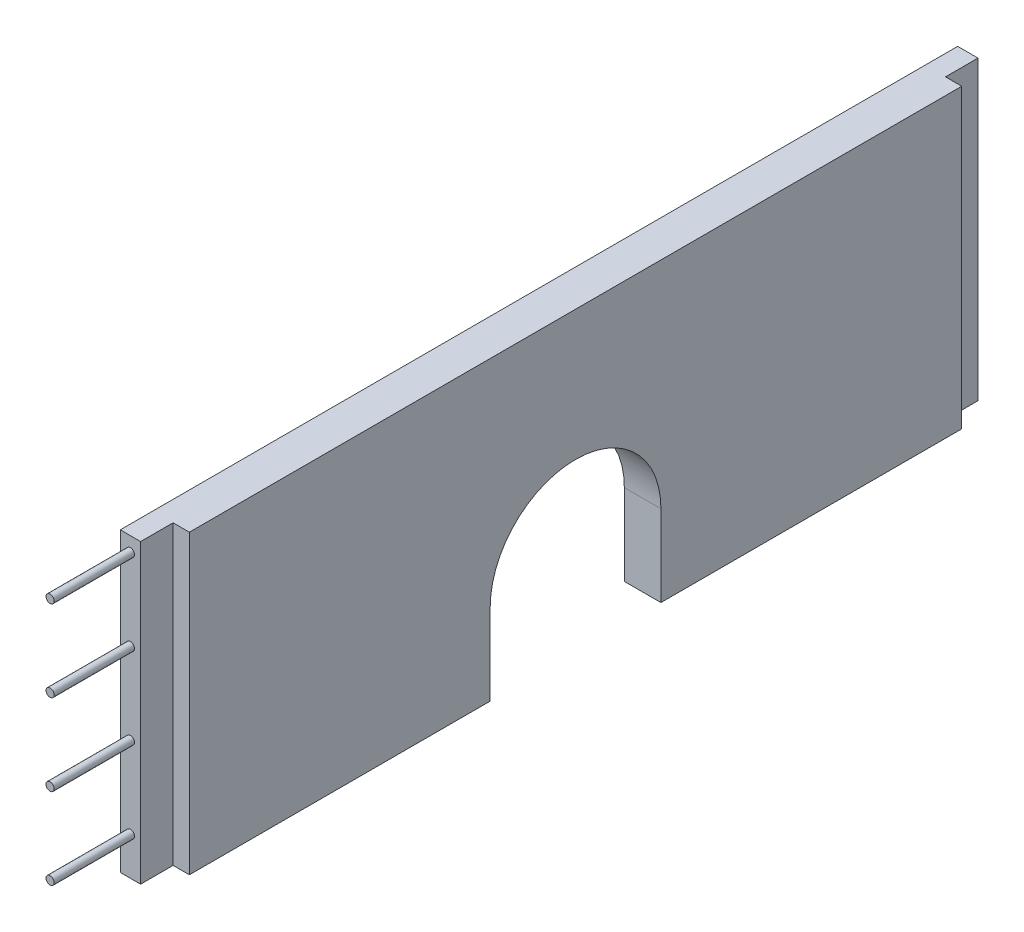
ISO-10303-21;
HEADER;
FILE_DESCRIPTION(('STEP AP214'),'2;1');
FILE_NAME('part.step','',(''),(''),'','','');
FILE_SCHEMA(('AUTOMOTIVE_DESIGN { 1 0 10303 214 1 1 1 1 }'));
ENDSEC;
DATA;
#1=APPLICATION_CONTEXT('core data for automotive mechanical design processes');
#2=APPLICATION_PROTOCOL_DEFINITION('international standard','automotive_design',2000,#1);
#3=PRODUCT_CONTEXT('',#1,'mechanical');
#4=PRODUCT('Part','Part','',(#3));
#5=PRODUCT_RELATED_PRODUCT_CATEGORY('part','',(#4));
#6=PRODUCT_DEFINITION_FORMATION('','',#4);
#7=PRODUCT_DEFINITION_CONTEXT('part definition',#1,'design');
#8=PRODUCT_DEFINITION('design','',#6,#7);
#9=PRODUCT_DEFINITION_SHAPE('','',#8);
#10=(LENGTH_UNIT() NAMED_UNIT(*) SI_UNIT(.MILLI.,.METRE.));
#11=(NAMED_UNIT(*) PLANE_ANGLE_UNIT() SI_UNIT($,.RADIAN.));
#12=(NAMED_UNIT(*) SI_UNIT($,.STERADIAN.) SOLID_ANGLE_UNIT());
#13=UNCERTAINTY_MEASURE_WITH_UNIT(LENGTH_MEASURE(1.E-05),#10,'distance_accuracy_value','');
#14=(GEOMETRIC_REPRESENTATION_CONTEXT(3) GLOBAL_UNCERTAINTY_ASSIGNED_CONTEXT((#13)) GLOBAL_UNIT_ASSIGNED_CONTEXT((#10,
#11,#12)) REPRESENTATION_CONTEXT('',''));
#15=CARTESIAN_POINT('',(0.,0.,0.));
#16=DIRECTION('',(0.,0.,1.));
#17=DIRECTION('',(1.,0.,0.));
#18=AXIS2_PLACEMENT_3D('',#15,#16,#17);
#19=CARTESIAN_POINT('',(2.5,99.5,0.));
#20=DIRECTION('',(1.,0.,0.));
#21=DIRECTION('',(0.,0.,-1.));
#22=AXIS2_PLACEMENT_3D('',#19,#20,#21);
#23=PLANE('',#22);
#24=DIRECTION('',(0.,-1.,0.));
#25=VECTOR('',#24,1.);
#26=CARTESIAN_POINT('',(2.5,99.5,0.));
#27=LINE('',#26,#25);
#28=CARTESIAN_POINT('',(2.5,36.5,0.));
#29=VERTEX_POINT('',#28);
#30=CARTESIAN_POINT('',(2.5,0.,0.));
#31=VERTEX_POINT('',#30);
#32=EDGE_CURVE('E267',#29,#31,#27,.T.);
#33=ORIENTED_EDGE('',*,*,#32,.F.);
#34=DIRECTION('',(0.,0.,-1.));
#35=VECTOR('',#34,1.);
#36=CARTESIAN_POINT('',(2.5,36.5,4.));
#37=LINE('',#36,#35);
#38=CARTESIAN_POINT('',(2.5,36.5,4.));
#39=VERTEX_POINT('',#38);
#40=EDGE_CURVE('E193',#39,#29,#37,.T.);
#41=ORIENTED_EDGE('',*,*,#40,.F.);
#42=DIRECTION('',(0.,-1.,0.));
#43=VECTOR('',#42,1.);
#44=CARTESIAN_POINT('',(2.5,99.5,4.));
#45=LINE('',#44,#43);
#46=CARTESIAN_POINT('',(2.5,0.,4.));
#47=VERTEX_POINT('',#46);
#48=EDGE_CURVE('E252',#39,#47,#45,.T.);
#49=ORIENTED_EDGE('',*,*,#48,.T.);
#50=DIRECTION('',(0.,0.,1.));
#51=VECTOR('',#50,1.);
#52=CARTESIAN_POINT('',(2.5,0.,0.));
#53=LINE('',#52,#51);
#54=EDGE_CURVE('E228',#31,#47,#53,.T.);
#55=ORIENTED_EDGE('',*,*,#54,.F.);
#56=EDGE_LOOP('',(#33,#41,#49,#55));
#57=FACE_BOUND('',#56,.T.);
#58=ADVANCED_FACE('F47',(#57),#23,.T.);
#59=CARTESIAN_POINT('',(0.,99.5,0.));
#60=DIRECTION('',(0.,0.,-1.));
#61=DIRECTION('',(-1.,0.,0.));
#62=AXIS2_PLACEMENT_3D('',#59,#60,#61);
#63=PLANE('',#62);
#64=DIRECTION('',(0.,-1.,0.));
#65=VECTOR('',#64,1.);
#66=CARTESIAN_POINT('',(0.,99.5,0.));
#67=LINE('',#66,#65);
#68=CARTESIAN_POINT('',(0.,36.5,0.));
#69=VERTEX_POINT('',#68);
#70=CARTESIAN_POINT('',(0.,0.,0.));
#71=VERTEX_POINT('',#70);
#72=EDGE_CURVE('E265',#69,#71,#67,.T.);
#73=ORIENTED_EDGE('',*,*,#72,.F.);
#74=DIRECTION('',(-1.,0.,0.));
#75=VECTOR('',#74,1.);
#76=CARTESIAN_POINT('',(2.5,36.5,0.));
#77=LINE('',#76,#75);
#78=EDGE_CURVE('E195',#29,#69,#77,.T.);
#79=ORIENTED_EDGE('',*,*,#78,.F.);
#80=ORIENTED_EDGE('',*,*,#32,.T.);
#81=DIRECTION('',(1.,0.,0.));
#82=VECTOR('',#81,1.);
#83=CARTESIAN_POINT('',(0.,0.,0.));
#84=LINE('',#83,#82);
#85=EDGE_CURVE('E231',#71,#31,#84,.T.);
#86=ORIENTED_EDGE('',*,*,#85,.F.);
#87=EDGE_LOOP('',(#73,#79,#80,#86));
#88=FACE_BOUND('',#87,.T.);
#89=ADVANCED_FACE('F49',(#88),#63,.T.);
#90=CARTESIAN_POINT('',(0.,99.5,0.));
#91=DIRECTION('',(1.,0.,0.));
#92=DIRECTION('',(0.,0.,-1.));
#93=AXIS2_PLACEMENT_3D('',#90,#91,#92);
#94=PLANE('',#93);
#95=DIRECTION('',(0.,0.,-1.));
#96=VECTOR('',#95,1.);
#97=CARTESIAN_POINT('',(0.,10.,82.5));
#98=LINE('',#97,#96);
#99=CARTESIAN_POINT('',(0.,10.,82.5));
#100=VERTEX_POINT('',#99);
#101=CARTESIAN_POINT('',(0.,10.,65.4999999999993));
#102=VERTEX_POINT('',#101);
#103=EDGE_CURVE('E167',#100,#102,#98,.T.);
#104=ORIENTED_EDGE('',*,*,#103,.F.);
#105=DIRECTION('',(0.,-1.,0.));
#106=VECTOR('',#105,1.);
#107=CARTESIAN_POINT('',(0.,10.,82.5));
#108=LINE('',#107,#106);
#109=CARTESIAN_POINT('',(0.,0.,82.5));
#110=VERTEX_POINT('',#109);
#111=EDGE_CURVE('E191',#100,#110,#108,.T.);
#112=ORIENTED_EDGE('',*,*,#111,.T.);
#113=DIRECTION('',(0.,0.,1.));
#114=VECTOR('',#113,1.);
#115=CARTESIAN_POINT('',(0.,0.,0.));
#116=LINE('',#115,#114);
#117=CARTESIAN_POINT('',(0.,0.,103.));
#118=VERTEX_POINT('',#117);
#119=EDGE_CURVE('E235',#110,#118,#116,.T.);
#120=ORIENTED_EDGE('',*,*,#119,.T.);
#121=DIRECTION('',(0.,-1.,0.));
#122=VECTOR('',#121,1.);
#123=CARTESIAN_POINT('',(0.,99.5,103.));
#124=LINE('',#123,#122);
#125=CARTESIAN_POINT('',(0.,36.5,103.));
#126=VERTEX_POINT('',#125);
#127=EDGE_CURVE('E262',#126,#118,#124,.T.);
#128=ORIENTED_EDGE('',*,*,#127,.F.);
#129=DIRECTION('',(0.,0.,1.));
#130=VECTOR('',#129,1.);
#131=CARTESIAN_POINT('',(0.,36.5,0.));
#132=LINE('',#131,#130);
#133=EDGE_CURVE('E197',#69,#126,#132,.T.);
#134=ORIENTED_EDGE('',*,*,#133,.F.);
#135=ORIENTED_EDGE('',*,*,#72,.T.);
#136=CARTESIAN_POINT('',(0.,0.,41.));
#137=VERTEX_POINT('',#136);
#138=EDGE_CURVE('E236',#71,#137,#116,.T.);
#139=ORIENTED_EDGE('',*,*,#138,.T.);
#140=DIRECTION('',(0.,-1.,0.));
#141=VECTOR('',#140,1.);
#142=CARTESIAN_POINT('',(0.,9.99999999999999,41.));
#143=LINE('',#142,#141);
#144=CARTESIAN_POINT('',(0.,9.99999999999999,41.));
#145=VERTEX_POINT('',#144);
#146=EDGE_CURVE('E206',#145,#137,#143,.T.);
#147=ORIENTED_EDGE('',*,*,#146,.F.);
#148=CARTESIAN_POINT('',(0.,9.99999999999999,51.5));
#149=DIRECTION('',(1.,0.,0.));
#150=DIRECTION('',(0.,0.,-1.));
#151=AXIS2_PLACEMENT_3D('',#148,#149,#150);
#152=CIRCLE('',#151,10.5);
#153=CARTESIAN_POINT('',(0.,9.99999999999999,62.));
#154=VERTEX_POINT('',#153);
#155=EDGE_CURVE('E208',#154,#145,#152,.F.);
#156=ORIENTED_EDGE('',*,*,#155,.F.);
#157=DIRECTION('',(0.,1.,0.));
#158=VECTOR('',#157,1.);
#159=CARTESIAN_POINT('',(0.,9.99999999999999,62.));
#160=LINE('',#159,#158);
#161=CARTESIAN_POINT('',(0.,0.,62.));
#162=VERTEX_POINT('',#161);
#163=EDGE_CURVE('E211',#162,#154,#160,.T.);
#164=ORIENTED_EDGE('',*,*,#163,.F.);
#165=CARTESIAN_POINT('',(0.,0.,65.4999999999993));
#166=VERTEX_POINT('',#165);
#167=EDGE_CURVE('E182',#162,#166,#116,.T.);
#168=ORIENTED_EDGE('',*,*,#167,.T.);
#169=DIRECTION('',(0.,-1.,0.));
#170=VECTOR('',#169,1.);
#171=CARTESIAN_POINT('',(0.,10.,65.4999999999993));
#172=LINE('',#171,#170);
#173=EDGE_CURVE('E62',#102,#166,#172,.T.);
#174=ORIENTED_EDGE('',*,*,#173,.F.);
#175=EDGE_LOOP('',(#104,#112,#120,#128,#134,#135,#139,#147,#156,#164,#168,#174));
#176=FACE_BOUND('',#175,.T.);
#177=ADVANCED_FACE('F179',(#176),#94,.F.);
#178=CARTESIAN_POINT('',(0.,99.5,103.));
#179=DIRECTION('',(0.,0.,-1.));
#180=DIRECTION('',(-1.,0.,0.));
#181=AXIS2_PLACEMENT_3D('',#178,#179,#180);
#182=PLANE('',#181);
#183=CARTESIAN_POINT('',(1.25000000000032,4.72284857889942,103.));
#184=DIRECTION('',(0.,0.,-1.));
#185=DIRECTION('',(-1.,0.,0.));
#186=AXIS2_PLACEMENT_3D('',#183,#184,#185);
#187=CIRCLE('',#186,0.5);
#188=CARTESIAN_POINT('',(0.750000000000325,4.72284857889942,103.));
#189=VERTEX_POINT('',#188);
#190=EDGE_CURVE('E11',#189,#189,#187,.F.);
#191=ORIENTED_EDGE('',*,*,#190,.F.);
#192=EDGE_LOOP('',(#191));
#193=FACE_BOUND('',#192,.T.);
#194=CARTESIAN_POINT('',(1.25000000000022,14.7228485788994,103.));
#195=DIRECTION('',(0.,0.,-1.));
#196=DIRECTION('',(-1.,0.,0.));
#197=AXIS2_PLACEMENT_3D('',#194,#195,#196);
#198=CIRCLE('',#197,0.5);
#199=CARTESIAN_POINT('',(0.75000000000022,14.7228485788994,103.));
#200=VERTEX_POINT('',#199);
#201=EDGE_CURVE('E55',#200,#200,#198,.F.);
#202=ORIENTED_EDGE('',*,*,#201,.F.);
#203=EDGE_LOOP('',(#202));
#204=FACE_BOUND('',#203,.T.);
#205=CARTESIAN_POINT('',(1.25000000000012,24.7228485788994,103.));
#206=DIRECTION('',(0.,0.,-1.));
#207=DIRECTION('',(-1.,0.,0.));
#208=AXIS2_PLACEMENT_3D('',#205,#206,#207);
#209=CIRCLE('',#208,0.5);
#210=CARTESIAN_POINT('',(0.750000000000116,24.7228485788994,103.));
#211=VERTEX_POINT('',#210);
#212=EDGE_CURVE('E272',#211,#211,#209,.F.);
#213=ORIENTED_EDGE('',*,*,#212,.F.);
#214=EDGE_LOOP('',(#213));
#215=FACE_BOUND('',#214,.T.);
#216=CARTESIAN_POINT('',(1.25000000000001,34.7228485788994,103.));
#217=DIRECTION('',(0.,0.,-1.));
#218=DIRECTION('',(-1.,0.,0.));
#219=AXIS2_PLACEMENT_3D('',#216,#217,#218);
#220=CIRCLE('',#219,0.5);
#221=CARTESIAN_POINT('',(0.750000000000012,34.7228485788994,103.));
#222=VERTEX_POINT('',#221);
#223=EDGE_CURVE('E269',#222,#222,#220,.F.);
#224=ORIENTED_EDGE('',*,*,#223,.F.);
#225=EDGE_LOOP('',(#224));
#226=FACE_BOUND('',#225,.T.);
#227=DIRECTION('',(1.,0.,0.));
#228=VECTOR('',#227,1.);
#229=CARTESIAN_POINT('',(0.,36.5,103.));
#230=LINE('',#229,#228);
#231=CARTESIAN_POINT('',(2.50000000000001,36.5,103.));
#232=VERTEX_POINT('',#231);
#233=EDGE_CURVE('E199',#126,#232,#230,.T.);
#234=ORIENTED_EDGE('',*,*,#233,.F.);
#235=ORIENTED_EDGE('',*,*,#127,.T.);
#236=DIRECTION('',(1.,0.,0.));
#237=VECTOR('',#236,1.);
#238=CARTESIAN_POINT('',(0.,0.,103.));
#239=LINE('',#238,#237);
#240=CARTESIAN_POINT('',(2.50000000000001,0.,103.));
#241=VERTEX_POINT('',#240);
#242=EDGE_CURVE('E239',#118,#241,#239,.T.);
#243=ORIENTED_EDGE('',*,*,#242,.T.);
#244=DIRECTION('',(0.,-1.,0.));
#245=VECTOR('',#244,1.);
#246=CARTESIAN_POINT('',(2.50000000000001,99.5,103.));
#247=LINE('',#246,#245);
#248=EDGE_CURVE('E260',#232,#241,#247,.T.);
#249=ORIENTED_EDGE('',*,*,#248,.F.);
#250=EDGE_LOOP('',(#234,#235,#243,#249));
#251=FACE_BOUND('',#250,.T.);
#252=ADVANCED_FACE('F279',(#193,#204,#215,#226,#251),#182,.F.);
#253=DIRECTION('',(0.,-1.,0.));
#254=VECTOR('',#253,1.);
#255=CARTESIAN_POINT('',(2.50000000000001,99.5,99.));
#256=LINE('',#255,#254);
#257=CARTESIAN_POINT('',(2.50000000000001,36.5,99.));
#258=VERTEX_POINT('',#257);
#259=CARTESIAN_POINT('',(2.50000000000001,0.,99.));
#260=VERTEX_POINT('',#259);
#261=EDGE_CURVE('E258',#258,#260,#256,.T.);
#262=ORIENTED_EDGE('',*,*,#261,.F.);
#263=DIRECTION('',(0.,0.,-1.));
#264=VECTOR('',#263,1.);
#265=CARTESIAN_POINT('',(2.50000000000001,36.5,103.));
#266=LINE('',#265,#264);
#267=EDGE_CURVE('E201',#232,#258,#266,.T.);
#268=ORIENTED_EDGE('',*,*,#267,.F.);
#269=ORIENTED_EDGE('',*,*,#248,.T.);
#270=EDGE_CURVE('E232',#260,#241,#53,.T.);
#271=ORIENTED_EDGE('',*,*,#270,.F.);
#272=EDGE_LOOP('',(#262,#268,#269,#271));
#273=FACE_BOUND('',#272,.T.);
#274=ADVANCED_FACE('F282',(#273),#23,.T.);
#275=CARTESIAN_POINT('',(0.,99.5,99.));
#276=DIRECTION('',(0.,0.,-1.));
#277=DIRECTION('',(-1.,0.,0.));
#278=AXIS2_PLACEMENT_3D('',#275,#276,#277);
#279=PLANE('',#278);
#280=DIRECTION('',(1.,0.,0.));
#281=VECTOR('',#280,1.);
#282=CARTESIAN_POINT('',(2.50000000000001,36.5,99.));
#283=LINE('',#282,#281);
#284=CARTESIAN_POINT('',(4.50000000000001,36.5,99.));
#285=VERTEX_POINT('',#284);
#286=EDGE_CURVE('E203',#258,#285,#283,.T.);
#287=ORIENTED_EDGE('',*,*,#286,.F.);
#288=ORIENTED_EDGE('',*,*,#261,.T.);
#289=DIRECTION('',(1.,0.,0.));
#290=VECTOR('',#289,1.);
#291=CARTESIAN_POINT('',(0.,0.,99.));
#292=LINE('',#291,#290);
#293=CARTESIAN_POINT('',(4.50000000000001,0.,99.));
#294=VERTEX_POINT('',#293);
#295=EDGE_CURVE('E242',#260,#294,#292,.T.);
#296=ORIENTED_EDGE('',*,*,#295,.T.);
#297=DIRECTION('',(0.,-1.,0.));
#298=VECTOR('',#297,1.);
#299=CARTESIAN_POINT('',(4.50000000000001,99.5,99.));
#300=LINE('',#299,#298);
#301=EDGE_CURVE('E256',#285,#294,#300,.T.);
#302=ORIENTED_EDGE('',*,*,#301,.F.);
#303=EDGE_LOOP('',(#287,#288,#296,#302));
#304=FACE_BOUND('',#303,.T.);
#305=ADVANCED_FACE('F311',(#304),#279,.F.);
#306=CARTESIAN_POINT('',(4.5,99.5,0.));
#307=DIRECTION('',(1.,0.,0.));
#308=DIRECTION('',(0.,0.,-1.));
#309=AXIS2_PLACEMENT_3D('',#306,#307,#308);
#310=PLANE('',#309);
#311=DIRECTION('',(0.,-1.,0.));
#312=VECTOR('',#311,1.);
#313=CARTESIAN_POINT('',(4.5,99.5,4.));
#314=LINE('',#313,#312);
#315=CARTESIAN_POINT('',(4.5,36.5,4.));
#316=VERTEX_POINT('',#315);
#317=CARTESIAN_POINT('',(4.5,0.,4.));
#318=VERTEX_POINT('',#317);
#319=EDGE_CURVE('E254',#316,#318,#314,.T.);
#320=ORIENTED_EDGE('',*,*,#319,.F.);
#321=DIRECTION('',(0.,0.,-1.));
#322=VECTOR('',#321,1.);
#323=CARTESIAN_POINT('',(4.50000000000001,36.5,99.));
#324=LINE('',#323,#322);
#325=EDGE_CURVE('E70',#285,#316,#324,.T.);
#326=ORIENTED_EDGE('',*,*,#325,.F.);
#327=ORIENTED_EDGE('',*,*,#301,.T.);
#328=DIRECTION('',(0.,0.,1.));
#329=VECTOR('',#328,1.);
#330=CARTESIAN_POINT('',(4.5,0.,0.));
#331=LINE('',#330,#329);
#332=CARTESIAN_POINT('',(4.50000000000001,0.,62.));
#333=VERTEX_POINT('',#332);
#334=EDGE_CURVE('E245',#333,#294,#331,.T.);
#335=ORIENTED_EDGE('',*,*,#334,.F.);
#336=DIRECTION('',(0.,-1.,0.));
#337=VECTOR('',#336,1.);
#338=CARTESIAN_POINT('',(4.50000000000001,9.99999999999999,62.));
#339=LINE('',#338,#337);
#340=CARTESIAN_POINT('',(4.50000000000001,9.99999999999999,62.));
#341=VERTEX_POINT('',#340);
#342=EDGE_CURVE('E214',#341,#333,#339,.T.);
#343=ORIENTED_EDGE('',*,*,#342,.F.);
#344=CARTESIAN_POINT('',(4.50000000000001,9.99999999999999,51.5));
#345=DIRECTION('',(1.,0.,0.));
#346=DIRECTION('',(0.,0.,-1.));
#347=AXIS2_PLACEMENT_3D('',#344,#345,#346);
#348=CIRCLE('',#347,10.5);
#349=CARTESIAN_POINT('',(4.5,9.99999999999999,41.));
#350=VERTEX_POINT('',#349);
#351=EDGE_CURVE('E205',#350,#341,#348,.T.);
#352=ORIENTED_EDGE('',*,*,#351,.F.);
#353=DIRECTION('',(0.,1.,0.));
#354=VECTOR('',#353,1.);
#355=CARTESIAN_POINT('',(4.5,9.99999999999999,41.));
#356=LINE('',#355,#354);
#357=CARTESIAN_POINT('',(4.5,0.,41.));
#358=VERTEX_POINT('',#357);
#359=EDGE_CURVE('E216',#358,#350,#356,.T.);
#360=ORIENTED_EDGE('',*,*,#359,.F.);
#361=EDGE_CURVE('E246',#318,#358,#331,.T.);
#362=ORIENTED_EDGE('',*,*,#361,.F.);
#363=EDGE_LOOP('',(#320,#326,#327,#335,#343,#352,#360,#362));
#364=FACE_BOUND('',#363,.T.);
#365=ADVANCED_FACE('F315',(#364),#310,.T.);
#366=CARTESIAN_POINT('',(0.,99.5,4.));
#367=DIRECTION('',(0.,0.,-1.));
#368=DIRECTION('',(-1.,0.,0.));
#369=AXIS2_PLACEMENT_3D('',#366,#367,#368);
#370=PLANE('',#369);
#371=ORIENTED_EDGE('',*,*,#48,.F.);
#372=DIRECTION('',(-1.,0.,0.));
#373=VECTOR('',#372,1.);
#374=CARTESIAN_POINT('',(4.5,36.5,4.));
#375=LINE('',#374,#373);
#376=EDGE_CURVE('E190',#316,#39,#375,.T.);
#377=ORIENTED_EDGE('',*,*,#376,.F.);
#378=ORIENTED_EDGE('',*,*,#319,.T.);
#379=DIRECTION('',(1.,0.,0.));
#380=VECTOR('',#379,1.);
#381=CARTESIAN_POINT('',(0.,0.,4.));
#382=LINE('',#381,#380);
#383=EDGE_CURVE('E249',#47,#318,#382,.T.);
#384=ORIENTED_EDGE('',*,*,#383,.F.);
#385=EDGE_LOOP('',(#371,#377,#378,#384));
#386=FACE_BOUND('',#385,.T.);
#387=ADVANCED_FACE('F338',(#386),#370,.T.);
#388=CARTESIAN_POINT('',(0.,0.,0.));
#389=DIRECTION('',(0.,1.,0.));
#390=DIRECTION('',(0.,0.,1.));
#391=AXIS2_PLACEMENT_3D('',#388,#389,#390);
#392=PLANE('',#391);
#393=ORIENTED_EDGE('',*,*,#361,.T.);
#394=DIRECTION('',(1.,0.,0.));
#395=VECTOR('',#394,1.);
#396=CARTESIAN_POINT('',(-29.3470611816584,0.,41.));
#397=LINE('',#396,#395);
#398=EDGE_CURVE('E221',#137,#358,#397,.T.);
#399=ORIENTED_EDGE('',*,*,#398,.F.);
#400=ORIENTED_EDGE('',*,*,#138,.F.);
#401=ORIENTED_EDGE('',*,*,#85,.T.);
#402=ORIENTED_EDGE('',*,*,#54,.T.);
#403=ORIENTED_EDGE('',*,*,#383,.T.);
#404=EDGE_LOOP('',(#393,#399,#400,#401,#402,#403));
#405=FACE_BOUND('',#404,.T.);
#406=ADVANCED_FACE('F332',(#405),#392,.F.);
#407=ORIENTED_EDGE('',*,*,#119,.F.);
#408=DIRECTION('',(-1.,0.,0.));
#409=VECTOR('',#408,1.);
#410=CARTESIAN_POINT('',(0.,0.,82.5));
#411=LINE('',#410,#409);
#412=CARTESIAN_POINT('',(1.6000000000003,0.,82.5));
#413=VERTEX_POINT('',#412);
#414=EDGE_CURVE('E176',#413,#110,#411,.T.);
#415=ORIENTED_EDGE('',*,*,#414,.F.);
#416=DIRECTION('',(0.,0.,1.));
#417=VECTOR('',#416,1.);
#418=CARTESIAN_POINT('',(1.6000000000003,0.,82.5));
#419=LINE('',#418,#417);
#420=CARTESIAN_POINT('',(1.6000000000003,0.,65.4999999999993));
#421=VERTEX_POINT('',#420);
#422=EDGE_CURVE('E437',#421,#413,#419,.T.);
#423=ORIENTED_EDGE('',*,*,#422,.F.);
#424=DIRECTION('',(1.,0.,0.));
#425=VECTOR('',#424,1.);
#426=CARTESIAN_POINT('',(0.,0.,65.4999999999993));
#427=LINE('',#426,#425);
#428=EDGE_CURVE('E433',#166,#421,#427,.T.);
#429=ORIENTED_EDGE('',*,*,#428,.F.);
#430=ORIENTED_EDGE('',*,*,#167,.F.);
#431=DIRECTION('',(1.,0.,0.));
#432=VECTOR('',#431,1.);
#433=CARTESIAN_POINT('',(-29.3470611816584,0.,62.));
#434=LINE('',#433,#432);
#435=EDGE_CURVE('E223',#162,#333,#434,.T.);
#436=ORIENTED_EDGE('',*,*,#435,.T.);
#437=ORIENTED_EDGE('',*,*,#334,.T.);
#438=ORIENTED_EDGE('',*,*,#295,.F.);
#439=ORIENTED_EDGE('',*,*,#270,.T.);
#440=ORIENTED_EDGE('',*,*,#242,.F.);
#441=EDGE_LOOP('',(#407,#415,#423,#429,#430,#436,#437,#438,#439,#440));
#442=FACE_BOUND('',#441,.T.);
#443=ADVANCED_FACE('F299',(#442),#392,.F.);
#444=CARTESIAN_POINT('',(-29.3470611816584,9.99999999999999,51.5));
#445=DIRECTION('',(1.,0.,0.));
#446=DIRECTION('',(0.,0.,-1.));
#447=AXIS2_PLACEMENT_3D('',#444,#445,#446);
#448=CYLINDRICAL_SURFACE('',#447,10.5);
#449=ORIENTED_EDGE('',*,*,#155,.T.);
#450=DIRECTION('',(1.,0.,0.));
#451=VECTOR('',#450,1.);
#452=CARTESIAN_POINT('',(-29.3470611816584,9.99999999999999,41.));
#453=LINE('',#452,#451);
#454=EDGE_CURVE('E209',#145,#350,#453,.T.);
#455=ORIENTED_EDGE('',*,*,#454,.T.);
#456=ORIENTED_EDGE('',*,*,#351,.T.);
#457=DIRECTION('',(1.,0.,0.));
#458=VECTOR('',#457,1.);
#459=CARTESIAN_POINT('',(-29.3470611816584,9.99999999999999,62.));
#460=LINE('',#459,#458);
#461=EDGE_CURVE('E219',#154,#341,#460,.T.);
#462=ORIENTED_EDGE('',*,*,#461,.F.);
#463=EDGE_LOOP('',(#449,#455,#456,#462));
#464=FACE_BOUND('',#463,.T.);
#465=ADVANCED_FACE('F324',(#464),#448,.F.);
#466=CARTESIAN_POINT('',(-29.3470611816584,9.99999999999999,41.));
#467=DIRECTION('',(0.,0.,-1.));
#468=DIRECTION('',(-1.,0.,0.));
#469=AXIS2_PLACEMENT_3D('',#466,#467,#468);
#470=PLANE('',#469);
#471=ORIENTED_EDGE('',*,*,#146,.T.);
#472=ORIENTED_EDGE('',*,*,#398,.T.);
#473=ORIENTED_EDGE('',*,*,#359,.T.);
#474=ORIENTED_EDGE('',*,*,#454,.F.);
#475=EDGE_LOOP('',(#471,#472,#473,#474));
#476=FACE_BOUND('',#475,.T.);
#477=ADVANCED_FACE('F326',(#476),#470,.F.);
#478=CARTESIAN_POINT('',(-29.3470611816584,9.99999999999999,62.));
#479=DIRECTION('',(0.,0.,1.));
#480=DIRECTION('',(1.,0.,0.));
#481=AXIS2_PLACEMENT_3D('',#478,#479,#480);
#482=PLANE('',#481);
#483=ORIENTED_EDGE('',*,*,#163,.T.);
#484=ORIENTED_EDGE('',*,*,#461,.T.);
#485=ORIENTED_EDGE('',*,*,#342,.T.);
#486=ORIENTED_EDGE('',*,*,#435,.F.);
#487=EDGE_LOOP('',(#483,#484,#485,#486));
#488=FACE_BOUND('',#487,.T.);
#489=ADVANCED_FACE('F318',(#488),#482,.F.);
#490=CARTESIAN_POINT('',(0.,36.5,0.));
#491=DIRECTION('',(0.,1.,0.));
#492=DIRECTION('',(0.,0.,1.));
#493=AXIS2_PLACEMENT_3D('',#490,#491,#492);
#494=PLANE('',#493);
#495=ORIENTED_EDGE('',*,*,#325,.T.);
#496=ORIENTED_EDGE('',*,*,#376,.T.);
#497=ORIENTED_EDGE('',*,*,#40,.T.);
#498=ORIENTED_EDGE('',*,*,#78,.T.);
#499=ORIENTED_EDGE('',*,*,#133,.T.);
#500=ORIENTED_EDGE('',*,*,#233,.T.);
#501=ORIENTED_EDGE('',*,*,#267,.T.);
#502=ORIENTED_EDGE('',*,*,#286,.T.);
#503=EDGE_LOOP('',(#495,#496,#497,#498,#499,#500,#501,#502));
#504=FACE_BOUND('',#503,.T.);
#505=ADVANCED_FACE('F308',(#504),#494,.T.);
#506=CARTESIAN_POINT('',(0.,10.,82.5));
#507=DIRECTION('',(0.,0.,1.));
#508=DIRECTION('',(1.,0.,0.));
#509=AXIS2_PLACEMENT_3D('',#506,#507,#508);
#510=PLANE('',#509);
#511=ORIENTED_EDGE('',*,*,#414,.T.);
#512=ORIENTED_EDGE('',*,*,#111,.F.);
#513=DIRECTION('',(-1.,0.,0.));
#514=VECTOR('',#513,1.);
#515=CARTESIAN_POINT('',(0.,10.,82.5));
#516=LINE('',#515,#514);
#517=CARTESIAN_POINT('',(1.6000000000003,10.,82.5));
#518=VERTEX_POINT('',#517);
#519=EDGE_CURVE('E173',#518,#100,#516,.T.);
#520=ORIENTED_EDGE('',*,*,#519,.F.);
#521=DIRECTION('',(0.,-1.,0.));
#522=VECTOR('',#521,1.);
#523=CARTESIAN_POINT('',(1.6000000000003,10.,82.5));
#524=LINE('',#523,#522);
#525=EDGE_CURVE('E184',#518,#413,#524,.T.);
#526=ORIENTED_EDGE('',*,*,#525,.T.);
#527=EDGE_LOOP('',(#511,#512,#520,#526));
#528=FACE_BOUND('',#527,.T.);
#529=ADVANCED_FACE('F376',(#528),#510,.F.);
#530=CARTESIAN_POINT('',(1.6000000000003,10.,82.5));
#531=DIRECTION('',(1.,0.,0.));
#532=DIRECTION('',(0.,0.,-1.));
#533=AXIS2_PLACEMENT_3D('',#530,#531,#532);
#534=PLANE('',#533);
#535=ORIENTED_EDGE('',*,*,#422,.T.);
#536=ORIENTED_EDGE('',*,*,#525,.F.);
#537=DIRECTION('',(0.,0.,1.));
#538=VECTOR('',#537,1.);
#539=CARTESIAN_POINT('',(1.6000000000003,10.,82.5));
#540=LINE('',#539,#538);
#541=CARTESIAN_POINT('',(1.6000000000003,10.,65.4999999999993));
#542=VERTEX_POINT('',#541);
#543=EDGE_CURVE('E166',#542,#518,#540,.T.);
#544=ORIENTED_EDGE('',*,*,#543,.F.);
#545=DIRECTION('',(0.,-1.,0.));
#546=VECTOR('',#545,1.);
#547=CARTESIAN_POINT('',(1.6000000000003,10.,65.4999999999993));
#548=LINE('',#547,#546);
#549=EDGE_CURVE('E162',#542,#421,#548,.T.);
#550=ORIENTED_EDGE('',*,*,#549,.T.);
#551=EDGE_LOOP('',(#535,#536,#544,#550));
#552=FACE_BOUND('',#551,.T.);
#553=ADVANCED_FACE('F379',(#552),#534,.F.);
#554=CARTESIAN_POINT('',(0.,10.,65.4999999999993));
#555=DIRECTION('',(0.,0.,-1.));
#556=DIRECTION('',(-1.,0.,0.));
#557=AXIS2_PLACEMENT_3D('',#554,#555,#556);
#558=PLANE('',#557);
#559=ORIENTED_EDGE('',*,*,#428,.T.);
#560=ORIENTED_EDGE('',*,*,#549,.F.);
#561=DIRECTION('',(1.,0.,0.));
#562=VECTOR('',#561,1.);
#563=CARTESIAN_POINT('',(0.,10.,65.4999999999993));
#564=LINE('',#563,#562);
#565=EDGE_CURVE('E159',#102,#542,#564,.T.);
#566=ORIENTED_EDGE('',*,*,#565,.F.);
#567=ORIENTED_EDGE('',*,*,#173,.T.);
#568=EDGE_LOOP('',(#559,#560,#566,#567));
#569=FACE_BOUND('',#568,.T.);
#570=ADVANCED_FACE('F161',(#569),#558,.F.);
#571=CARTESIAN_POINT('',(0.,10.,0.));
#572=DIRECTION('',(0.,-1.,0.));
#573=DIRECTION('',(0.,0.,-1.));
#574=AXIS2_PLACEMENT_3D('',#571,#572,#573);
#575=PLANE('',#574);
#576=ORIENTED_EDGE('',*,*,#103,.T.);
#577=ORIENTED_EDGE('',*,*,#565,.T.);
#578=ORIENTED_EDGE('',*,*,#543,.T.);
#579=ORIENTED_EDGE('',*,*,#519,.T.);
#580=EDGE_LOOP('',(#576,#577,#578,#579));
#581=FACE_BOUND('',#580,.T.);
#582=ADVANCED_FACE('F171',(#581),#575,.T.);
#583=CARTESIAN_POINT('',(1.25000000000001,34.7228485788994,114.300677153207));
#584=DIRECTION('',(0.,0.,-1.));
#585=DIRECTION('',(-1.,0.,0.));
#586=AXIS2_PLACEMENT_3D('',#583,#584,#585);
#587=CYLINDRICAL_SURFACE('',#586,0.5);
#588=CARTESIAN_POINT('',(1.25000000000001,34.7228485788994,112.886463590834));
#589=DIRECTION('',(0.,0.,-1.));
#590=DIRECTION('',(0.,1.,0.));
#591=AXIS2_PLACEMENT_3D('',#588,#589,#590);
#592=CIRCLE('',#591,0.5);
#593=CARTESIAN_POINT('',(1.25000000000001,35.2228485788994,112.886463590834));
#594=VERTEX_POINT('',#593);
#595=EDGE_CURVE('E431',#594,#594,#592,.T.);
#596=ORIENTED_EDGE('',*,*,#595,.T.);
#597=EDGE_LOOP('',(#596));
#598=FACE_BOUND('',#597,.T.);
#599=ORIENTED_EDGE('',*,*,#223,.T.);
#600=EDGE_LOOP('',(#599));
#601=FACE_BOUND('',#600,.T.);
#602=ADVANCED_FACE('F388',(#598,#601),#587,.T.);
#603=CARTESIAN_POINT('',(-109.478637531114,-7.07654525946699,112.886463590834));
#604=DIRECTION('',(0.,0.,-1.));
#605=DIRECTION('',(0.,1.,0.));
#606=AXIS2_PLACEMENT_3D('',#603,#604,#605);
#607=PLANE('',#606);
#608=ORIENTED_EDGE('',*,*,#595,.F.);
#609=EDGE_LOOP('',(#608));
#610=FACE_BOUND('',#609,.T.);
#611=ADVANCED_FACE('F391',(#610),#607,.F.);
#612=CARTESIAN_POINT('',(1.25000000000012,24.7228485788994,114.300677153207));
#613=DIRECTION('',(0.,0.,-1.));
#614=DIRECTION('',(-1.,0.,0.));
#615=AXIS2_PLACEMENT_3D('',#612,#613,#614);
#616=CYLINDRICAL_SURFACE('',#615,0.5);
#617=CARTESIAN_POINT('',(1.25000000000012,24.7228485788994,112.886463590834));
#618=DIRECTION('',(0.,0.,-1.));
#619=DIRECTION('',(0.,1.,0.));
#620=AXIS2_PLACEMENT_3D('',#617,#618,#619);
#621=CIRCLE('',#620,0.5);
#622=CARTESIAN_POINT('',(1.25000000000012,25.2228485788994,112.886463590834));
#623=VERTEX_POINT('',#622);
#624=EDGE_CURVE('E426',#623,#623,#621,.T.);
#625=ORIENTED_EDGE('',*,*,#624,.T.);
#626=EDGE_LOOP('',(#625));
#627=FACE_BOUND('',#626,.T.);
#628=ORIENTED_EDGE('',*,*,#212,.T.);
#629=EDGE_LOOP('',(#628));
#630=FACE_BOUND('',#629,.T.);
#631=ADVANCED_FACE('F395',(#627,#630),#616,.T.);
#632=CARTESIAN_POINT('',(-109.478637531114,-7.07654525946699,112.886463590834));
#633=DIRECTION('',(0.,0.,-1.));
#634=DIRECTION('',(0.,1.,0.));
#635=AXIS2_PLACEMENT_3D('',#632,#633,#634);
#636=PLANE('',#635);
#637=ORIENTED_EDGE('',*,*,#624,.F.);
#638=EDGE_LOOP('',(#637));
#639=FACE_BOUND('',#638,.T.);
#640=ADVANCED_FACE('F399',(#639),#636,.F.);
#641=CARTESIAN_POINT('',(1.25000000000022,14.7228485788994,114.300677153207));
#642=DIRECTION('',(0.,0.,-1.));
#643=DIRECTION('',(-1.,0.,0.));
#644=AXIS2_PLACEMENT_3D('',#641,#642,#643);
#645=CYLINDRICAL_SURFACE('',#644,0.5);
#646=CARTESIAN_POINT('',(1.25000000000022,14.7228485788994,112.886463590834));
#647=DIRECTION('',(0.,0.,-1.));
#648=DIRECTION('',(0.,1.,0.));
#649=AXIS2_PLACEMENT_3D('',#646,#647,#648);
#650=CIRCLE('',#649,0.5);
#651=CARTESIAN_POINT('',(1.25000000000022,15.2228485788994,112.886463590834));
#652=VERTEX_POINT('',#651);
#653=EDGE_CURVE('E423',#652,#652,#650,.T.);
#654=ORIENTED_EDGE('',*,*,#653,.T.);
#655=EDGE_LOOP('',(#654));
#656=FACE_BOUND('',#655,.T.);
#657=ORIENTED_EDGE('',*,*,#201,.T.);
#658=EDGE_LOOP('',(#657));
#659=FACE_BOUND('',#658,.T.);
#660=ADVANCED_FACE('F277',(#656,#659),#645,.T.);
#661=CARTESIAN_POINT('',(-109.478637531114,-7.07654525946699,112.886463590834));
#662=DIRECTION('',(0.,0.,-1.));
#663=DIRECTION('',(0.,1.,0.));
#664=AXIS2_PLACEMENT_3D('',#661,#662,#663);
#665=PLANE('',#664);
#666=ORIENTED_EDGE('',*,*,#653,.F.);
#667=EDGE_LOOP('',(#666));
#668=FACE_BOUND('',#667,.T.);
#669=ADVANCED_FACE('F406',(#668),#665,.F.);
#670=CARTESIAN_POINT('',(1.25000000000032,4.72284857889942,114.300677153207));
#671=DIRECTION('',(0.,0.,-1.));
#672=DIRECTION('',(-1.,0.,0.));
#673=AXIS2_PLACEMENT_3D('',#670,#671,#672);
#674=CYLINDRICAL_SURFACE('',#673,0.5);
#675=CARTESIAN_POINT('',(1.25000000000032,4.72284857889942,112.886463590834));
#676=DIRECTION('',(0.,0.,-1.));
#677=DIRECTION('',(0.,1.,0.));
#678=AXIS2_PLACEMENT_3D('',#675,#676,#677);
#679=CIRCLE('',#678,0.5);
#680=CARTESIAN_POINT('',(1.25000000000032,5.22284857889942,112.886463590834));
#681=VERTEX_POINT('',#680);
#682=EDGE_CURVE('E422',#681,#681,#679,.T.);
#683=ORIENTED_EDGE('',*,*,#682,.T.);
#684=EDGE_LOOP('',(#683));
#685=FACE_BOUND('',#684,.T.);
#686=ORIENTED_EDGE('',*,*,#190,.T.);
#687=EDGE_LOOP('',(#686));
#688=FACE_BOUND('',#687,.T.);
#689=ADVANCED_FACE('F410',(#685,#688),#674,.T.);
#690=CARTESIAN_POINT('',(-109.478637531114,-7.07654525946699,112.886463590834));
#691=DIRECTION('',(0.,0.,-1.));
#692=DIRECTION('',(0.,1.,0.));
#693=AXIS2_PLACEMENT_3D('',#690,#691,#692);
#694=PLANE('',#693);
#695=ORIENTED_EDGE('',*,*,#682,.F.);
#696=EDGE_LOOP('',(#695));
#697=FACE_BOUND('',#696,.T.);
#698=ADVANCED_FACE('F414',(#697),#694,.F.);
#699=CLOSED_SHELL('',(#58,#89,#177,#252,#274,#305,#365,#387,#406,#443,#465,#477,#489,#505,#529,
#553,#570,#582,#602,#611,#631,#640,#660,#669,#689,#698));
#700=MANIFOLD_SOLID_BREP('B2',#699);
#701=ADVANCED_BREP_SHAPE_REPRESENTATION('',(#18,#700),#14);
#702=SHAPE_DEFINITION_REPRESENTATION(#9,#701);
ENDSEC;
END-ISO-10303-21;
